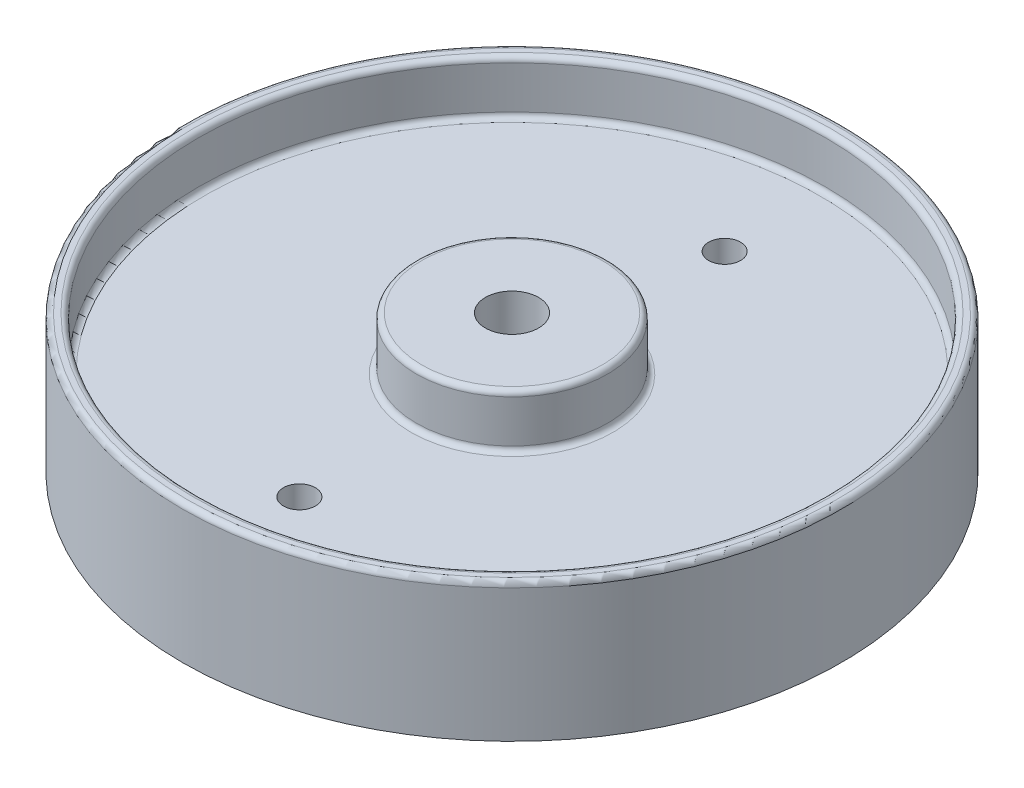
ISO-10303-21;
HEADER;
FILE_DESCRIPTION(('STEP AP214'),'2;1');
FILE_NAME('part.step','',(''),(''),'','','');
FILE_SCHEMA(('AUTOMOTIVE_DESIGN { 1 0 10303 214 1 1 1 1 }'));
ENDSEC;
DATA;
#1=APPLICATION_CONTEXT('core data for automotive mechanical design processes');
#2=APPLICATION_PROTOCOL_DEFINITION('international standard','automotive_design',2000,#1);
#3=PRODUCT_CONTEXT('',#1,'mechanical');
#4=PRODUCT('Part','Part','',(#3));
#5=PRODUCT_RELATED_PRODUCT_CATEGORY('part','',(#4));
#6=PRODUCT_DEFINITION_FORMATION('','',#4);
#7=PRODUCT_DEFINITION_CONTEXT('part definition',#1,'design');
#8=PRODUCT_DEFINITION('design','',#6,#7);
#9=PRODUCT_DEFINITION_SHAPE('','',#8);
#10=(LENGTH_UNIT() NAMED_UNIT(*) SI_UNIT(.MILLI.,.METRE.));
#11=(NAMED_UNIT(*) PLANE_ANGLE_UNIT() SI_UNIT($,.RADIAN.));
#12=(NAMED_UNIT(*) SI_UNIT($,.STERADIAN.) SOLID_ANGLE_UNIT());
#13=UNCERTAINTY_MEASURE_WITH_UNIT(LENGTH_MEASURE(1.E-05),#10,'distance_accuracy_value','');
#14=(GEOMETRIC_REPRESENTATION_CONTEXT(3) GLOBAL_UNCERTAINTY_ASSIGNED_CONTEXT((#13)) GLOBAL_UNIT_ASSIGNED_CONTEXT((#10,
#11,#12)) REPRESENTATION_CONTEXT('',''));
#15=CARTESIAN_POINT('',(0.,0.,0.));
#16=DIRECTION('',(0.,0.,1.));
#17=DIRECTION('',(1.,0.,0.));
#18=AXIS2_PLACEMENT_3D('',#15,#16,#17);
#19=CARTESIAN_POINT('',(0.,13.,0.));
#20=DIRECTION('',(0.,1.,0.));
#21=DIRECTION('',(0.,0.,1.));
#22=AXIS2_PLACEMENT_3D('',#19,#20,#21);
#23=PLANE('',#22);
#24=CARTESIAN_POINT('',(0.,13.,0.));
#25=DIRECTION('',(0.,1.,0.));
#26=DIRECTION('',(0.,0.,1.));
#27=AXIS2_PLACEMENT_3D('',#24,#25,#26);
#28=CIRCLE('',#27,8.5);
#29=CARTESIAN_POINT('',(0.,13.,8.5));
#30=VERTEX_POINT('',#29);
#31=EDGE_CURVE('E10',#30,#30,#28,.T.);
#32=ORIENTED_EDGE('',*,*,#31,.T.);
#33=EDGE_LOOP('',(#32));
#34=FACE_BOUND('',#33,.T.);
#35=CARTESIAN_POINT('',(0.,13.,0.));
#36=DIRECTION('',(0.,1.,0.));
#37=DIRECTION('',(0.,0.,1.));
#38=AXIS2_PLACEMENT_3D('',#35,#36,#37);
#39=CIRCLE('',#38,2.5);
#40=CARTESIAN_POINT('',(0.,13.,-2.5));
#41=VERTEX_POINT('',#40);
#42=EDGE_CURVE('E71',#41,#41,#39,.T.);
#43=ORIENTED_EDGE('',*,*,#42,.F.);
#44=EDGE_LOOP('',(#43));
#45=FACE_BOUND('',#44,.T.);
#46=ADVANCED_FACE('F30',(#34,#45),#23,.T.);
#47=CARTESIAN_POINT('',(0.,13.,0.));
#48=DIRECTION('',(0.,1.,0.));
#49=DIRECTION('',(0.,0.,1.));
#50=AXIS2_PLACEMENT_3D('',#47,#48,#49);
#51=CIRCLE('',#50,30.);
#52=CARTESIAN_POINT('',(0.,13.,30.));
#53=VERTEX_POINT('',#52);
#54=EDGE_CURVE('E56',#53,#53,#51,.F.);
#55=ORIENTED_EDGE('',*,*,#54,.T.);
#56=EDGE_LOOP('',(#55));
#57=FACE_BOUND('',#56,.T.);
#58=CARTESIAN_POINT('',(0.,13.,0.));
#59=DIRECTION('',(0.,1.,0.));
#60=DIRECTION('',(0.,0.,1.));
#61=AXIS2_PLACEMENT_3D('',#58,#59,#60);
#62=CIRCLE('',#61,30.5);
#63=CARTESIAN_POINT('',(0.,13.,30.5));
#64=VERTEX_POINT('',#63);
#65=EDGE_CURVE('E59',#64,#64,#62,.T.);
#66=ORIENTED_EDGE('',*,*,#65,.T.);
#67=EDGE_LOOP('',(#66));
#68=FACE_BOUND('',#67,.T.);
#69=ADVANCED_FACE('F136',(#57,#68),#23,.T.);
#70=CARTESIAN_POINT('',(0.,0.,0.));
#71=DIRECTION('',(0.,1.,0.));
#72=DIRECTION('',(0.,0.,1.));
#73=AXIS2_PLACEMENT_3D('',#70,#71,#72);
#74=PLANE('',#73);
#75=CARTESIAN_POINT('',(0.,0.,0.));
#76=DIRECTION('',(0.,1.,0.));
#77=DIRECTION('',(0.,0.,1.));
#78=AXIS2_PLACEMENT_3D('',#75,#76,#77);
#79=CIRCLE('',#78,31.);
#80=CARTESIAN_POINT('',(0.,0.,-31.));
#81=VERTEX_POINT('',#80);
#82=EDGE_CURVE('E68',#81,#81,#79,.T.);
#83=ORIENTED_EDGE('',*,*,#82,.F.);
#84=EDGE_LOOP('',(#83));
#85=FACE_BOUND('',#84,.T.);
#86=CARTESIAN_POINT('',(0.,0.,0.));
#87=DIRECTION('',(0.,1.,0.));
#88=DIRECTION('',(0.,0.,1.));
#89=AXIS2_PLACEMENT_3D('',#86,#87,#88);
#90=CIRCLE('',#89,2.5);
#91=CARTESIAN_POINT('',(0.,0.,-2.5));
#92=VERTEX_POINT('',#91);
#93=EDGE_CURVE('E72',#92,#92,#90,.T.);
#94=ORIENTED_EDGE('',*,*,#93,.T.);
#95=EDGE_LOOP('',(#94));
#96=FACE_BOUND('',#95,.T.);
#97=ADVANCED_FACE('F141',(#85,#96),#74,.F.);
#98=CARTESIAN_POINT('',(0.,13.,0.));
#99=DIRECTION('',(0.,-1.,0.));
#100=DIRECTION('',(0.,0.,-1.));
#101=AXIS2_PLACEMENT_3D('',#98,#99,#100);
#102=CYLINDRICAL_SURFACE('',#101,31.);
#103=CARTESIAN_POINT('',(0.,12.5,0.));
#104=DIRECTION('',(0.,1.,0.));
#105=DIRECTION('',(0.,0.,1.));
#106=AXIS2_PLACEMENT_3D('',#103,#104,#105);
#107=CIRCLE('',#106,31.);
#108=CARTESIAN_POINT('',(0.,12.5,-31.));
#109=VERTEX_POINT('',#108);
#110=EDGE_CURVE('E37',#109,#109,#107,.F.);
#111=CARTESIAN_POINT('',(0.,12.5,-31.));
#112=CARTESIAN_POINT('',(0.,12.3697916666667,-31.));
#113=CARTESIAN_POINT('',(0.,12.2395833333333,-31.));
#114=CARTESIAN_POINT('',(0.,11.9791666666667,-31.));
#115=CARTESIAN_POINT('',(0.,11.8489583333333,-31.));
#116=CARTESIAN_POINT('',(0.,11.5885416666667,-31.));
#117=CARTESIAN_POINT('',(0.,11.4583333333333,-31.));
#118=CARTESIAN_POINT('',(0.,11.1979166666667,-31.));
#119=CARTESIAN_POINT('',(0.,11.0677083333333,-31.));
#120=CARTESIAN_POINT('',(0.,10.8072916666667,-31.));
#121=CARTESIAN_POINT('',(0.,10.6770833333333,-31.));
#122=CARTESIAN_POINT('',(0.,10.4166666666667,-31.));
#123=CARTESIAN_POINT('',(0.,10.2864583333333,-31.));
#124=CARTESIAN_POINT('',(0.,10.0260416666667,-31.));
#125=CARTESIAN_POINT('',(0.,9.89583333333333,-31.));
#126=CARTESIAN_POINT('',(0.,9.63541666666667,-31.));
#127=CARTESIAN_POINT('',(0.,9.50520833333333,-31.));
#128=CARTESIAN_POINT('',(0.,9.24479166666666,-31.));
#129=CARTESIAN_POINT('',(0.,9.11458333333333,-31.));
#130=CARTESIAN_POINT('',(0.,8.85416666666667,-31.));
#131=CARTESIAN_POINT('',(0.,8.72395833333333,-31.));
#132=CARTESIAN_POINT('',(0.,8.46354166666667,-31.));
#133=CARTESIAN_POINT('',(0.,8.33333333333333,-31.));
#134=CARTESIAN_POINT('',(0.,8.07291666666667,-31.));
#135=CARTESIAN_POINT('',(0.,7.94270833333333,-31.));
#136=CARTESIAN_POINT('',(0.,7.68229166666667,-31.));
#137=CARTESIAN_POINT('',(0.,7.55208333333333,-31.));
#138=CARTESIAN_POINT('',(0.,7.29166666666667,-31.));
#139=CARTESIAN_POINT('',(0.,7.16145833333333,-31.));
#140=CARTESIAN_POINT('',(0.,6.90104166666667,-31.));
#141=CARTESIAN_POINT('',(0.,6.77083333333333,-31.));
#142=CARTESIAN_POINT('',(0.,6.51041666666667,-31.));
#143=CARTESIAN_POINT('',(0.,6.38020833333333,-31.));
#144=CARTESIAN_POINT('',(0.,6.11979166666667,-31.));
#145=CARTESIAN_POINT('',(0.,5.98958333333333,-31.));
#146=CARTESIAN_POINT('',(0.,5.72916666666667,-31.));
#147=CARTESIAN_POINT('',(0.,5.59895833333333,-31.));
#148=CARTESIAN_POINT('',(0.,5.33854166666667,-31.));
#149=CARTESIAN_POINT('',(0.,5.20833333333333,-31.));
#150=CARTESIAN_POINT('',(0.,4.94791666666667,-31.));
#151=CARTESIAN_POINT('',(0.,4.81770833333333,-31.));
#152=CARTESIAN_POINT('',(0.,4.55729166666667,-31.));
#153=CARTESIAN_POINT('',(0.,4.42708333333333,-31.));
#154=CARTESIAN_POINT('',(0.,4.16666666666667,-31.));
#155=CARTESIAN_POINT('',(0.,4.03645833333333,-31.));
#156=CARTESIAN_POINT('',(0.,3.77604166666667,-31.));
#157=CARTESIAN_POINT('',(0.,3.64583333333333,-31.));
#158=CARTESIAN_POINT('',(0.,3.38541666666667,-31.));
#159=CARTESIAN_POINT('',(0.,3.25520833333333,-31.));
#160=CARTESIAN_POINT('',(0.,2.99479166666667,-31.));
#161=CARTESIAN_POINT('',(0.,2.86458333333333,-31.));
#162=CARTESIAN_POINT('',(0.,2.60416666666667,-31.));
#163=CARTESIAN_POINT('',(0.,2.47395833333333,-31.));
#164=CARTESIAN_POINT('',(0.,2.21354166666667,-31.));
#165=CARTESIAN_POINT('',(0.,2.08333333333333,-31.));
#166=CARTESIAN_POINT('',(0.,1.82291666666667,-31.));
#167=CARTESIAN_POINT('',(0.,1.69270833333333,-31.));
#168=CARTESIAN_POINT('',(0.,1.43229166666666,-31.));
#169=CARTESIAN_POINT('',(0.,1.30208333333333,-31.));
#170=CARTESIAN_POINT('',(0.,1.04166666666667,-31.));
#171=CARTESIAN_POINT('',(0.,0.911458333333334,-31.));
#172=CARTESIAN_POINT('',(0.,0.651041666666667,-31.));
#173=CARTESIAN_POINT('',(0.,0.520833333333333,-31.));
#174=CARTESIAN_POINT('',(0.,0.260416666666666,-31.));
#175=CARTESIAN_POINT('',(0.,0.130208333333333,-31.));
#176=CARTESIAN_POINT('',(0.,0.,-31.));
#177=B_SPLINE_CURVE_WITH_KNOTS('',3,(#111,#112,#113,#114,#115,#116,#117,#118,#119,#120,#121,
#122,#123,#124,#125,#126,#127,#128,#129,#130,#131,#132,#133,#134,#135,#136,#137,#138,#139,#140,
#141,#142,#143,#144,#145,#146,#147,#148,#149,#150,#151,#152,#153,#154,#155,#156,#157,#158,#159,
#160,#161,#162,#163,#164,#165,#166,#167,#168,#169,#170,#171,#172,#173,#174,#175,#176),
.UNSPECIFIED.,.F.,.F.,(4,2,2,2,2,2,2,2,2,2,2,2,2,2,2,2,2,2,2,2,2,2,2,2,2,2,2,2,2,2,2,2,4),(0.,
0.390625,0.781250000000001,1.171875,1.5625,1.953125,2.34375,2.734375,3.125,3.515625,3.90625,
4.296875,4.6875,5.078125,5.46875,5.859375,6.25,6.640625,7.03125,7.421875,7.8125,8.203125,
8.59375,8.984375,9.375,9.765625,10.15625,10.546875,10.9375,11.328125,11.71875,12.109375,12.5),.UNSPECIFIED.);
#178=EDGE_CURVE('BSEAM150',#109,#81,#177,.T.);
#179=ORIENTED_EDGE('',*,*,#110,.T.);
#180=ORIENTED_EDGE('',*,*,#82,.T.);
#181=ORIENTED_EDGE('',*,*,#178,.T.);
#182=ORIENTED_EDGE('',*,*,#178,.F.);
#183=EDGE_LOOP('',(#179,#181,#180,#182));
#184=FACE_BOUND('',#183,.T.);
#185=ADVANCED_FACE('F150',(#184),#102,.T.);
#186=CARTESIAN_POINT('',(0.,13.,0.));
#187=DIRECTION('',(0.,-1.,0.));
#188=DIRECTION('',(0.,0.,-1.));
#189=AXIS2_PLACEMENT_3D('',#186,#187,#188);
#190=CYLINDRICAL_SURFACE('',#189,2.5);
#191=CARTESIAN_POINT('',(0.,13.,-2.5));
#192=CARTESIAN_POINT('',(0.,12.8645833333333,-2.5));
#193=CARTESIAN_POINT('',(0.,12.7291666666667,-2.5));
#194=CARTESIAN_POINT('',(0.,12.4583333333333,-2.5));
#195=CARTESIAN_POINT('',(0.,12.3229166666667,-2.5));
#196=CARTESIAN_POINT('',(0.,12.0520833333333,-2.5));
#197=CARTESIAN_POINT('',(0.,11.9166666666667,-2.5));
#198=CARTESIAN_POINT('',(0.,11.6458333333333,-2.5));
#199=CARTESIAN_POINT('',(0.,11.5104166666667,-2.5));
#200=CARTESIAN_POINT('',(0.,11.2395833333333,-2.5));
#201=CARTESIAN_POINT('',(0.,11.1041666666667,-2.5));
#202=CARTESIAN_POINT('',(0.,10.8333333333333,-2.5));
#203=CARTESIAN_POINT('',(0.,10.6979166666667,-2.5));
#204=CARTESIAN_POINT('',(0.,10.4270833333333,-2.5));
#205=CARTESIAN_POINT('',(0.,10.2916666666667,-2.5));
#206=CARTESIAN_POINT('',(0.,10.0208333333333,-2.5));
#207=CARTESIAN_POINT('',(0.,9.88541666666667,-2.5));
#208=CARTESIAN_POINT('',(0.,9.61458333333333,-2.5));
#209=CARTESIAN_POINT('',(0.,9.47916666666667,-2.5));
#210=CARTESIAN_POINT('',(0.,9.20833333333333,-2.5));
#211=CARTESIAN_POINT('',(0.,9.07291666666667,-2.5));
#212=CARTESIAN_POINT('',(0.,8.80208333333333,-2.5));
#213=CARTESIAN_POINT('',(0.,8.66666666666667,-2.5));
#214=CARTESIAN_POINT('',(0.,8.39583333333333,-2.5));
#215=CARTESIAN_POINT('',(0.,8.26041666666667,-2.5));
#216=CARTESIAN_POINT('',(0.,7.98958333333333,-2.5));
#217=CARTESIAN_POINT('',(0.,7.85416666666667,-2.5));
#218=CARTESIAN_POINT('',(0.,7.58333333333333,-2.5));
#219=CARTESIAN_POINT('',(0.,7.44791666666667,-2.5));
#220=CARTESIAN_POINT('',(0.,7.17708333333333,-2.5));
#221=CARTESIAN_POINT('',(0.,7.04166666666667,-2.5));
#222=CARTESIAN_POINT('',(0.,6.77083333333333,-2.5));
#223=CARTESIAN_POINT('',(0.,6.63541666666667,-2.5));
#224=CARTESIAN_POINT('',(0.,6.36458333333333,-2.5));
#225=CARTESIAN_POINT('',(0.,6.22916666666667,-2.5));
#226=CARTESIAN_POINT('',(0.,5.95833333333333,-2.5));
#227=CARTESIAN_POINT('',(0.,5.82291666666667,-2.5));
#228=CARTESIAN_POINT('',(0.,5.55208333333333,-2.5));
#229=CARTESIAN_POINT('',(0.,5.41666666666667,-2.5));
#230=CARTESIAN_POINT('',(0.,5.14583333333333,-2.5));
#231=CARTESIAN_POINT('',(0.,5.01041666666667,-2.5));
#232=CARTESIAN_POINT('',(0.,4.73958333333333,-2.5));
#233=CARTESIAN_POINT('',(0.,4.60416666666667,-2.5));
#234=CARTESIAN_POINT('',(0.,4.33333333333333,-2.5));
#235=CARTESIAN_POINT('',(0.,4.19791666666667,-2.5));
#236=CARTESIAN_POINT('',(0.,3.92708333333333,-2.5));
#237=CARTESIAN_POINT('',(0.,3.79166666666667,-2.5));
#238=CARTESIAN_POINT('',(0.,3.52083333333333,-2.5));
#239=CARTESIAN_POINT('',(0.,3.38541666666667,-2.5));
#240=CARTESIAN_POINT('',(0.,3.11458333333333,-2.5));
#241=CARTESIAN_POINT('',(0.,2.97916666666667,-2.5));
#242=CARTESIAN_POINT('',(0.,2.70833333333333,-2.5));
#243=CARTESIAN_POINT('',(0.,2.57291666666667,-2.5));
#244=CARTESIAN_POINT('',(0.,2.30208333333333,-2.5));
#245=CARTESIAN_POINT('',(0.,2.16666666666667,-2.5));
#246=CARTESIAN_POINT('',(0.,1.89583333333333,-2.5));
#247=CARTESIAN_POINT('',(0.,1.76041666666667,-2.5));
#248=CARTESIAN_POINT('',(0.,1.48958333333333,-2.5));
#249=CARTESIAN_POINT('',(0.,1.35416666666667,-2.5));
#250=CARTESIAN_POINT('',(0.,1.08333333333333,-2.5));
#251=CARTESIAN_POINT('',(0.,0.947916666666667,-2.5));
#252=CARTESIAN_POINT('',(0.,0.677083333333334,-2.5));
#253=CARTESIAN_POINT('',(0.,0.541666666666667,-2.5));
#254=CARTESIAN_POINT('',(0.,0.270833333333334,-2.5));
#255=CARTESIAN_POINT('',(0.,0.135416666666667,-2.5));
#256=CARTESIAN_POINT('',(0.,0.,-2.5));
#257=B_SPLINE_CURVE_WITH_KNOTS('',3,(#191,#192,#193,#194,#195,#196,#197,#198,#199,#200,#201,
#202,#203,#204,#205,#206,#207,#208,#209,#210,#211,#212,#213,#214,#215,#216,#217,#218,#219,#220,
#221,#222,#223,#224,#225,#226,#227,#228,#229,#230,#231,#232,#233,#234,#235,#236,#237,#238,#239,
#240,#241,#242,#243,#244,#245,#246,#247,#248,#249,#250,#251,#252,#253,#254,#255,#256),
.UNSPECIFIED.,.F.,.F.,(4,2,2,2,2,2,2,2,2,2,2,2,2,2,2,2,2,2,2,2,2,2,2,2,2,2,2,2,2,2,2,2,4),(0.,
0.406249999999999,0.812499999999999,1.21875,1.625,2.03125,2.4375,2.84375,3.25,3.65625,4.0625,
4.46875,4.875,5.28125,5.6875,6.09375,6.5,6.90625,7.3125,7.71875,8.125,8.53125,8.9375,9.34375,
9.75,10.15625,10.5625,10.96875,11.375,11.78125,12.1875,12.59375,13.),.UNSPECIFIED.);
#258=EDGE_CURVE('BSEAM146',#41,#92,#257,.T.);
#259=ORIENTED_EDGE('',*,*,#42,.T.);
#260=ORIENTED_EDGE('',*,*,#93,.F.);
#261=ORIENTED_EDGE('',*,*,#258,.T.);
#262=ORIENTED_EDGE('',*,*,#258,.F.);
#263=EDGE_LOOP('',(#259,#261,#260,#262));
#264=FACE_BOUND('',#263,.T.);
#265=ADVANCED_FACE('F146',(#264),#190,.F.);
#266=CARTESIAN_POINT('',(0.,8.,0.));
#267=DIRECTION('',(0.,1.,0.));
#268=DIRECTION('',(0.,0.,1.));
#269=AXIS2_PLACEMENT_3D('',#266,#267,#268);
#270=CYLINDRICAL_SURFACE('',#269,29.5);
#271=CARTESIAN_POINT('',(0.,12.5,0.));
#272=DIRECTION('',(0.,1.,0.));
#273=DIRECTION('',(0.,0.,1.));
#274=AXIS2_PLACEMENT_3D('',#271,#272,#273);
#275=CIRCLE('',#274,29.5);
#276=CARTESIAN_POINT('',(0.,12.5,29.5));
#277=VERTEX_POINT('',#276);
#278=EDGE_CURVE('E62',#277,#277,#275,.T.);
#279=ORIENTED_EDGE('',*,*,#278,.T.);
#280=EDGE_LOOP('',(#279));
#281=FACE_BOUND('',#280,.T.);
#282=CARTESIAN_POINT('',(0.,8.5,0.));
#283=DIRECTION('',(0.,1.,0.));
#284=DIRECTION('',(0.,0.,1.));
#285=AXIS2_PLACEMENT_3D('',#282,#283,#284);
#286=CIRCLE('',#285,29.5);
#287=CARTESIAN_POINT('',(0.,8.5,29.5));
#288=VERTEX_POINT('',#287);
#289=EDGE_CURVE('E65',#288,#288,#286,.F.);
#290=ORIENTED_EDGE('',*,*,#289,.T.);
#291=EDGE_LOOP('',(#290));
#292=FACE_BOUND('',#291,.T.);
#293=ADVANCED_FACE('F103',(#281,#292),#270,.F.);
#294=CARTESIAN_POINT('',(0.,8.,0.));
#295=DIRECTION('',(0.,1.,0.));
#296=DIRECTION('',(0.,0.,1.));
#297=AXIS2_PLACEMENT_3D('',#294,#295,#296);
#298=PLANE('',#297);
#299=CARTESIAN_POINT('',(0.,8.,20.));
#300=DIRECTION('',(0.,1.,0.));
#301=DIRECTION('',(0.,0.,1.));
#302=AXIS2_PLACEMENT_3D('',#299,#300,#301);
#303=CIRCLE('',#302,1.5);
#304=CARTESIAN_POINT('',(0.,8.,21.5));
#305=VERTEX_POINT('',#304);
#306=EDGE_CURVE('E84',#305,#305,#303,.T.);
#307=ORIENTED_EDGE('',*,*,#306,.F.);
#308=EDGE_LOOP('',(#307));
#309=FACE_BOUND('',#308,.T.);
#310=CARTESIAN_POINT('',(0.,8.,-20.));
#311=DIRECTION('',(0.,1.,0.));
#312=DIRECTION('',(0.,0.,1.));
#313=AXIS2_PLACEMENT_3D('',#310,#311,#312);
#314=CIRCLE('',#313,1.5);
#315=CARTESIAN_POINT('',(0.,8.,-18.5));
#316=VERTEX_POINT('',#315);
#317=EDGE_CURVE('E78',#316,#316,#314,.T.);
#318=ORIENTED_EDGE('',*,*,#317,.F.);
#319=EDGE_LOOP('',(#318));
#320=FACE_BOUND('',#319,.T.);
#321=CARTESIAN_POINT('',(0.,8.,0.));
#322=DIRECTION('',(0.,1.,0.));
#323=DIRECTION('',(0.,0.,1.));
#324=AXIS2_PLACEMENT_3D('',#321,#322,#323);
#325=CIRCLE('',#324,29.);
#326=CARTESIAN_POINT('',(0.,8.,29.));
#327=VERTEX_POINT('',#326);
#328=EDGE_CURVE('E50',#327,#327,#325,.T.);
#329=ORIENTED_EDGE('',*,*,#328,.T.);
#330=EDGE_LOOP('',(#329));
#331=FACE_BOUND('',#330,.T.);
#332=CARTESIAN_POINT('',(0.,8.,0.));
#333=DIRECTION('',(0.,1.,0.));
#334=DIRECTION('',(0.,0.,1.));
#335=AXIS2_PLACEMENT_3D('',#332,#333,#334);
#336=CIRCLE('',#335,9.5);
#337=CARTESIAN_POINT('',(0.,8.,9.5));
#338=VERTEX_POINT('',#337);
#339=EDGE_CURVE('E53',#338,#338,#336,.F.);
#340=ORIENTED_EDGE('',*,*,#339,.T.);
#341=EDGE_LOOP('',(#340));
#342=FACE_BOUND('',#341,.T.);
#343=ADVANCED_FACE('F99',(#309,#320,#331,#342),#298,.T.);
#344=CARTESIAN_POINT('',(0.,8.,0.));
#345=DIRECTION('',(0.,1.,0.));
#346=DIRECTION('',(0.,0.,1.));
#347=AXIS2_PLACEMENT_3D('',#344,#345,#346);
#348=CYLINDRICAL_SURFACE('',#347,9.);
#349=CARTESIAN_POINT('',(0.,8.5,0.));
#350=DIRECTION('',(0.,1.,0.));
#351=DIRECTION('',(0.,0.,1.));
#352=AXIS2_PLACEMENT_3D('',#349,#350,#351);
#353=CIRCLE('',#352,9.);
#354=CARTESIAN_POINT('',(0.,8.5,9.));
#355=VERTEX_POINT('',#354);
#356=EDGE_CURVE('E41',#355,#355,#353,.T.);
#357=ORIENTED_EDGE('',*,*,#356,.T.);
#358=EDGE_LOOP('',(#357));
#359=FACE_BOUND('',#358,.T.);
#360=CARTESIAN_POINT('',(0.,12.5,0.));
#361=DIRECTION('',(0.,1.,0.));
#362=DIRECTION('',(0.,0.,1.));
#363=AXIS2_PLACEMENT_3D('',#360,#361,#362);
#364=CIRCLE('',#363,9.);
#365=CARTESIAN_POINT('',(0.,12.5,9.));
#366=VERTEX_POINT('',#365);
#367=EDGE_CURVE('E45',#366,#366,#364,.F.);
#368=ORIENTED_EDGE('',*,*,#367,.T.);
#369=EDGE_LOOP('',(#368));
#370=FACE_BOUND('',#369,.T.);
#371=ADVANCED_FACE('F102',(#359,#370),#348,.T.);
#372=CARTESIAN_POINT('',(0.,12.5,0.));
#373=DIRECTION('',(0.,1.,0.));
#374=DIRECTION('',(0.,0.,1.));
#375=AXIS2_PLACEMENT_3D('',#372,#373,#374);
#376=TOROIDAL_SURFACE('',#375,30.,0.5);
#377=ORIENTED_EDGE('',*,*,#54,.F.);
#378=EDGE_LOOP('',(#377));
#379=FACE_BOUND('',#378,.T.);
#380=ORIENTED_EDGE('',*,*,#278,.F.);
#381=EDGE_LOOP('',(#380));
#382=FACE_BOUND('',#381,.T.);
#383=ADVANCED_FACE('F121',(#379,#382),#376,.T.);
#384=CARTESIAN_POINT('',(0.,8.5,0.));
#385=DIRECTION('',(0.,1.,0.));
#386=DIRECTION('',(0.,0.,1.));
#387=AXIS2_PLACEMENT_3D('',#384,#385,#386);
#388=TOROIDAL_SURFACE('',#387,29.,0.5);
#389=ORIENTED_EDGE('',*,*,#289,.F.);
#390=EDGE_LOOP('',(#389));
#391=FACE_BOUND('',#390,.T.);
#392=ORIENTED_EDGE('',*,*,#328,.F.);
#393=EDGE_LOOP('',(#392));
#394=FACE_BOUND('',#393,.T.);
#395=ADVANCED_FACE('F115',(#391,#394),#388,.F.);
#396=CARTESIAN_POINT('',(0.,8.5,0.));
#397=DIRECTION('',(0.,1.,0.));
#398=DIRECTION('',(0.,0.,1.));
#399=AXIS2_PLACEMENT_3D('',#396,#397,#398);
#400=TOROIDAL_SURFACE('',#399,9.5,0.5);
#401=ORIENTED_EDGE('',*,*,#339,.F.);
#402=EDGE_LOOP('',(#401));
#403=FACE_BOUND('',#402,.T.);
#404=ORIENTED_EDGE('',*,*,#356,.F.);
#405=EDGE_LOOP('',(#404));
#406=FACE_BOUND('',#405,.T.);
#407=ADVANCED_FACE('F111',(#403,#406),#400,.F.);
#408=CARTESIAN_POINT('',(0.,12.5,0.));
#409=DIRECTION('',(0.,1.,0.));
#410=DIRECTION('',(0.,0.,1.));
#411=AXIS2_PLACEMENT_3D('',#408,#409,#410);
#412=TOROIDAL_SURFACE('',#411,30.5,0.5);
#413=ORIENTED_EDGE('',*,*,#110,.F.);
#414=EDGE_LOOP('',(#413));
#415=FACE_BOUND('',#414,.T.);
#416=ORIENTED_EDGE('',*,*,#65,.F.);
#417=EDGE_LOOP('',(#416));
#418=FACE_BOUND('',#417,.T.);
#419=ADVANCED_FACE('F114',(#415,#418),#412,.T.);
#420=CARTESIAN_POINT('',(0.,12.5,0.));
#421=DIRECTION('',(0.,1.,0.));
#422=DIRECTION('',(0.,0.,1.));
#423=AXIS2_PLACEMENT_3D('',#420,#421,#422);
#424=TOROIDAL_SURFACE('',#423,8.5,0.5);
#425=ORIENTED_EDGE('',*,*,#367,.F.);
#426=EDGE_LOOP('',(#425));
#427=FACE_BOUND('',#426,.T.);
#428=ORIENTED_EDGE('',*,*,#31,.F.);
#429=EDGE_LOOP('',(#428));
#430=FACE_BOUND('',#429,.T.);
#431=ADVANCED_FACE('F32',(#427,#430),#424,.T.);
#432=CARTESIAN_POINT('',(0.,3.,-20.));
#433=DIRECTION('',(0.,1.,0.));
#434=DIRECTION('',(0.,0.,1.));
#435=AXIS2_PLACEMENT_3D('',#432,#433,#434);
#436=CYLINDRICAL_SURFACE('',#435,1.5);
#437=CARTESIAN_POINT('',(0.,3.,-20.));
#438=DIRECTION('',(0.,1.,0.));
#439=DIRECTION('',(0.,0.,1.));
#440=AXIS2_PLACEMENT_3D('',#437,#438,#439);
#441=CIRCLE('',#440,1.5);
#442=CARTESIAN_POINT('',(0.,3.,-18.5));
#443=VERTEX_POINT('',#442);
#444=EDGE_CURVE('E75',#443,#443,#441,.T.);
#445=ORIENTED_EDGE('',*,*,#444,.F.);
#446=EDGE_LOOP('',(#445));
#447=FACE_BOUND('',#446,.T.);
#448=ORIENTED_EDGE('',*,*,#317,.T.);
#449=EDGE_LOOP('',(#448));
#450=FACE_BOUND('',#449,.T.);
#451=ADVANCED_FACE('F127',(#447,#450),#436,.F.);
#452=CARTESIAN_POINT('',(0.,3.,-20.));
#453=DIRECTION('',(0.,1.,0.));
#454=DIRECTION('',(0.,0.,1.));
#455=AXIS2_PLACEMENT_3D('',#452,#453,#454);
#456=PLANE('',#455);
#457=ORIENTED_EDGE('',*,*,#444,.T.);
#458=EDGE_LOOP('',(#457));
#459=FACE_BOUND('',#458,.T.);
#460=ADVANCED_FACE('F95',(#459),#456,.T.);
#461=CARTESIAN_POINT('',(0.,3.,20.));
#462=DIRECTION('',(0.,1.,0.));
#463=DIRECTION('',(0.,0.,1.));
#464=AXIS2_PLACEMENT_3D('',#461,#462,#463);
#465=CYLINDRICAL_SURFACE('',#464,1.5);
#466=CARTESIAN_POINT('',(0.,3.,20.));
#467=DIRECTION('',(0.,1.,0.));
#468=DIRECTION('',(0.,0.,1.));
#469=AXIS2_PLACEMENT_3D('',#466,#467,#468);
#470=CIRCLE('',#469,1.5);
#471=CARTESIAN_POINT('',(0.,3.,21.5));
#472=VERTEX_POINT('',#471);
#473=EDGE_CURVE('E81',#472,#472,#470,.T.);
#474=ORIENTED_EDGE('',*,*,#473,.F.);
#475=EDGE_LOOP('',(#474));
#476=FACE_BOUND('',#475,.T.);
#477=ORIENTED_EDGE('',*,*,#306,.T.);
#478=EDGE_LOOP('',(#477));
#479=FACE_BOUND('',#478,.T.);
#480=ADVANCED_FACE('F92',(#476,#479),#465,.F.);
#481=CARTESIAN_POINT('',(0.,3.,20.));
#482=DIRECTION('',(0.,1.,0.));
#483=DIRECTION('',(0.,0.,1.));
#484=AXIS2_PLACEMENT_3D('',#481,#482,#483);
#485=PLANE('',#484);
#486=ORIENTED_EDGE('',*,*,#473,.T.);
#487=EDGE_LOOP('',(#486));
#488=FACE_BOUND('',#487,.T.);
#489=ADVANCED_FACE('F90',(#488),#485,.T.);
#490=CLOSED_SHELL('',(#46,#69,#97,#185,#265,#293,#343,#371,#383,#395,#407,#419,#431,#451,#460,
#480,#489));
#491=MANIFOLD_SOLID_BREP('B2',#490);
#492=ADVANCED_BREP_SHAPE_REPRESENTATION('',(#18,#491),#14);
#493=SHAPE_DEFINITION_REPRESENTATION(#9,#492);
ENDSEC;
END-ISO-10303-21;
